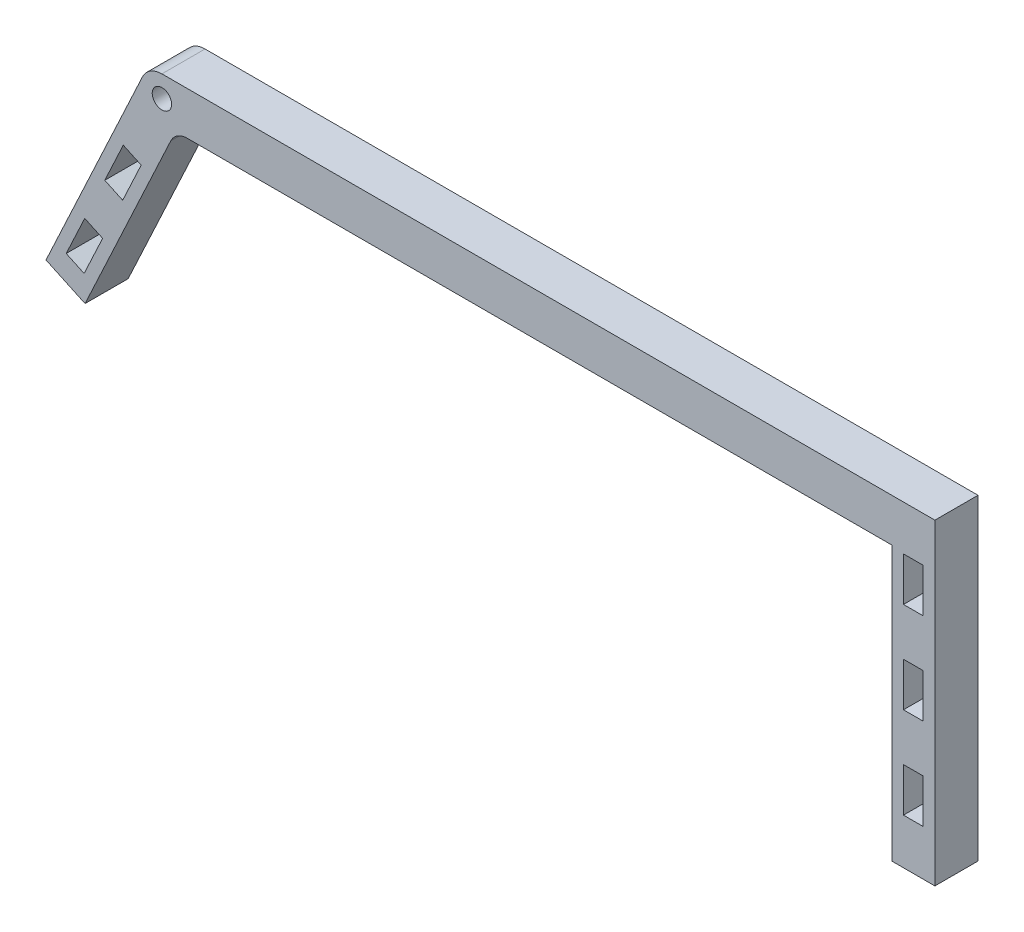
ISO-10303-21;
HEADER;
FILE_DESCRIPTION(('STEP AP214'),'2;1');
FILE_NAME('part.step','',(''),(''),'','','');
FILE_SCHEMA(('AUTOMOTIVE_DESIGN { 1 0 10303 214 1 1 1 1 }'));
ENDSEC;
DATA;
#1=APPLICATION_CONTEXT('core data for automotive mechanical design processes');
#2=APPLICATION_PROTOCOL_DEFINITION('international standard','automotive_design',2000,#1);
#3=PRODUCT_CONTEXT('',#1,'mechanical');
#4=PRODUCT('Part','Part','',(#3));
#5=PRODUCT_RELATED_PRODUCT_CATEGORY('part','',(#4));
#6=PRODUCT_DEFINITION_FORMATION('','',#4);
#7=PRODUCT_DEFINITION_CONTEXT('part definition',#1,'design');
#8=PRODUCT_DEFINITION('design','',#6,#7);
#9=PRODUCT_DEFINITION_SHAPE('','',#8);
#10=(LENGTH_UNIT() NAMED_UNIT(*) SI_UNIT(.MILLI.,.METRE.));
#11=(NAMED_UNIT(*) PLANE_ANGLE_UNIT() SI_UNIT($,.RADIAN.));
#12=(NAMED_UNIT(*) SI_UNIT($,.STERADIAN.) SOLID_ANGLE_UNIT());
#13=UNCERTAINTY_MEASURE_WITH_UNIT(LENGTH_MEASURE(1.E-05),#10,'distance_accuracy_value','');
#14=(GEOMETRIC_REPRESENTATION_CONTEXT(3) GLOBAL_UNCERTAINTY_ASSIGNED_CONTEXT((#13)) GLOBAL_UNIT_ASSIGNED_CONTEXT((#10,
#11,#12)) REPRESENTATION_CONTEXT('',''));
#15=CARTESIAN_POINT('',(0.,0.,0.));
#16=DIRECTION('',(0.,0.,1.));
#17=DIRECTION('',(1.,0.,0.));
#18=AXIS2_PLACEMENT_3D('',#15,#16,#17);
#19=CARTESIAN_POINT('',(50.925,-9.34999999999999,-3.));
#20=DIRECTION('',(0.,-1.,0.));
#21=DIRECTION('',(0.,0.,-1.));
#22=AXIS2_PLACEMENT_3D('',#19,#20,#21);
#23=PLANE('',#22);
#24=DIRECTION('',(1.,0.,0.));
#25=VECTOR('',#24,1.);
#26=CARTESIAN_POINT('',(0.,-9.34999999999999,3.));
#27=LINE('',#26,#25);
#28=CARTESIAN_POINT('',(50.925,-9.34999999999999,3.));
#29=VERTEX_POINT('',#28);
#30=CARTESIAN_POINT('',(53.675,-9.34999999999999,3.));
#31=VERTEX_POINT('',#30);
#32=EDGE_CURVE('E556',#29,#31,#27,.T.);
#33=ORIENTED_EDGE('',*,*,#32,.T.);
#34=DIRECTION('',(0.,0.,1.));
#35=VECTOR('',#34,1.);
#36=CARTESIAN_POINT('',(53.675,-9.34999999999999,-3.));
#37=LINE('',#36,#35);
#38=CARTESIAN_POINT('',(53.675,-9.34999999999999,-3.));
#39=VERTEX_POINT('',#38);
#40=EDGE_CURVE('E11',#39,#31,#37,.T.);
#41=ORIENTED_EDGE('',*,*,#40,.F.);
#42=DIRECTION('',(1.,0.,0.));
#43=VECTOR('',#42,1.);
#44=CARTESIAN_POINT('',(50.925,-9.34999999999999,-3.));
#45=LINE('',#44,#43);
#46=CARTESIAN_POINT('',(50.925,-9.34999999999999,-3.));
#47=VERTEX_POINT('',#46);
#48=EDGE_CURVE('E562',#47,#39,#45,.T.);
#49=ORIENTED_EDGE('',*,*,#48,.F.);
#50=DIRECTION('',(0.,0.,1.));
#51=VECTOR('',#50,1.);
#52=CARTESIAN_POINT('',(50.925,-9.34999999999999,-3.));
#53=LINE('',#52,#51);
#54=EDGE_CURVE('E570',#47,#29,#53,.T.);
#55=ORIENTED_EDGE('',*,*,#54,.T.);
#56=EDGE_LOOP('',(#33,#41,#49,#55));
#57=FACE_BOUND('',#56,.T.);
#58=ADVANCED_FACE('F49',(#57),#23,.F.);
#59=CARTESIAN_POINT('',(53.675,-3.25399999999999,-3.));
#60=DIRECTION('',(1.,0.,0.));
#61=DIRECTION('',(0.,0.,-1.));
#62=AXIS2_PLACEMENT_3D('',#59,#60,#61);
#63=PLANE('',#62);
#64=DIRECTION('',(0.,1.,0.));
#65=VECTOR('',#64,1.);
#66=CARTESIAN_POINT('',(53.675,25.4,3.));
#67=LINE('',#66,#65);
#68=CARTESIAN_POINT('',(53.675,-3.25399999999999,3.));
#69=VERTEX_POINT('',#68);
#70=EDGE_CURVE('E552',#31,#69,#67,.T.);
#71=ORIENTED_EDGE('',*,*,#70,.T.);
#72=DIRECTION('',(0.,0.,1.));
#73=VECTOR('',#72,1.);
#74=CARTESIAN_POINT('',(53.675,-3.25399999999999,-3.));
#75=LINE('',#74,#73);
#76=CARTESIAN_POINT('',(53.675,-3.25399999999999,-3.));
#77=VERTEX_POINT('',#76);
#78=EDGE_CURVE('E57',#77,#69,#75,.T.);
#79=ORIENTED_EDGE('',*,*,#78,.F.);
#80=DIRECTION('',(0.,1.,0.));
#81=VECTOR('',#80,1.);
#82=CARTESIAN_POINT('',(53.675,-3.25399999999999,-3.));
#83=LINE('',#82,#81);
#84=EDGE_CURVE('E71',#39,#77,#83,.T.);
#85=ORIENTED_EDGE('',*,*,#84,.F.);
#86=ORIENTED_EDGE('',*,*,#40,.T.);
#87=EDGE_LOOP('',(#71,#79,#85,#86));
#88=FACE_BOUND('',#87,.T.);
#89=ADVANCED_FACE('F583',(#88),#63,.F.);
#90=CARTESIAN_POINT('',(50.925,-3.25399999999999,-3.));
#91=DIRECTION('',(0.,1.,0.));
#92=DIRECTION('',(0.,0.,1.));
#93=AXIS2_PLACEMENT_3D('',#90,#91,#92);
#94=PLANE('',#93);
#95=DIRECTION('',(-1.,0.,0.));
#96=VECTOR('',#95,1.);
#97=CARTESIAN_POINT('',(0.,-3.25399999999999,3.));
#98=LINE('',#97,#96);
#99=CARTESIAN_POINT('',(50.925,-3.25399999999999,3.));
#100=VERTEX_POINT('',#99);
#101=EDGE_CURVE('E548',#69,#100,#98,.T.);
#102=ORIENTED_EDGE('',*,*,#101,.T.);
#103=DIRECTION('',(0.,0.,1.));
#104=VECTOR('',#103,1.);
#105=CARTESIAN_POINT('',(50.925,-3.25399999999999,-3.));
#106=LINE('',#105,#104);
#107=CARTESIAN_POINT('',(50.925,-3.25399999999999,-3.));
#108=VERTEX_POINT('',#107);
#109=EDGE_CURVE('E574',#108,#100,#106,.T.);
#110=ORIENTED_EDGE('',*,*,#109,.F.);
#111=DIRECTION('',(-1.,0.,0.));
#112=VECTOR('',#111,1.);
#113=CARTESIAN_POINT('',(50.925,-3.25399999999999,-3.));
#114=LINE('',#113,#112);
#115=EDGE_CURVE('E567',#77,#108,#114,.T.);
#116=ORIENTED_EDGE('',*,*,#115,.F.);
#117=ORIENTED_EDGE('',*,*,#78,.T.);
#118=EDGE_LOOP('',(#102,#110,#116,#117));
#119=FACE_BOUND('',#118,.T.);
#120=ADVANCED_FACE('F580',(#119),#94,.F.);
#121=CARTESIAN_POINT('',(50.925,-3.25399999999999,-3.));
#122=DIRECTION('',(-1.,0.,0.));
#123=DIRECTION('',(0.,0.,1.));
#124=AXIS2_PLACEMENT_3D('',#121,#122,#123);
#125=PLANE('',#124);
#126=DIRECTION('',(0.,-1.,0.));
#127=VECTOR('',#126,1.);
#128=CARTESIAN_POINT('',(50.925,25.4,3.));
#129=LINE('',#128,#127);
#130=EDGE_CURVE('E545',#100,#29,#129,.T.);
#131=ORIENTED_EDGE('',*,*,#130,.T.);
#132=ORIENTED_EDGE('',*,*,#54,.F.);
#133=DIRECTION('',(0.,-1.,0.));
#134=VECTOR('',#133,1.);
#135=CARTESIAN_POINT('',(50.925,-3.25399999999999,-3.));
#136=LINE('',#135,#134);
#137=EDGE_CURVE('E64',#108,#47,#136,.T.);
#138=ORIENTED_EDGE('',*,*,#137,.F.);
#139=ORIENTED_EDGE('',*,*,#109,.T.);
#140=EDGE_LOOP('',(#131,#132,#138,#139));
#141=FACE_BOUND('',#140,.T.);
#142=ADVANCED_FACE('F589',(#141),#125,.F.);
#143=CARTESIAN_POINT('',(0.,3.,3.));
#144=DIRECTION('',(0.,1.,0.));
#145=DIRECTION('',(-1.,0.,0.));
#146=AXIS2_PLACEMENT_3D('',#143,#144,#145);
#147=PLANE('',#146);
#148=DIRECTION('',(1.,0.,0.));
#149=VECTOR('',#148,1.);
#150=CARTESIAN_POINT('',(0.,3.,-3.));
#151=LINE('',#150,#149);
#152=CARTESIAN_POINT('',(-52.3,3.,-3.));
#153=VERTEX_POINT('',#152);
#154=CARTESIAN_POINT('',(55.3,3.,-3.));
#155=VERTEX_POINT('',#154);
#156=EDGE_CURVE('E474',#153,#155,#151,.T.);
#157=ORIENTED_EDGE('',*,*,#156,.F.);
#158=DIRECTION('',(0.,0.,-1.));
#159=VECTOR('',#158,1.);
#160=CARTESIAN_POINT('',(-52.3,3.,3.));
#161=LINE('',#160,#159);
#162=CARTESIAN_POINT('',(-52.3,3.,3.));
#163=VERTEX_POINT('',#162);
#164=EDGE_CURVE('E529',#163,#153,#161,.T.);
#165=ORIENTED_EDGE('',*,*,#164,.F.);
#166=DIRECTION('',(1.,0.,0.));
#167=VECTOR('',#166,1.);
#168=CARTESIAN_POINT('',(0.,3.,3.));
#169=LINE('',#168,#167);
#170=CARTESIAN_POINT('',(55.3,3.,3.));
#171=VERTEX_POINT('',#170);
#172=EDGE_CURVE('E437',#163,#171,#169,.T.);
#173=ORIENTED_EDGE('',*,*,#172,.T.);
#174=DIRECTION('',(0.,0.,-1.));
#175=VECTOR('',#174,1.);
#176=CARTESIAN_POINT('',(55.3,3.,3.));
#177=LINE('',#176,#175);
#178=EDGE_CURVE('E470',#171,#155,#177,.T.);
#179=ORIENTED_EDGE('',*,*,#178,.T.);
#180=EDGE_LOOP('',(#157,#165,#173,#179));
#181=FACE_BOUND('',#180,.T.);
#182=ADVANCED_FACE('F591',(#181),#147,.T.);
#183=CARTESIAN_POINT('',(-52.3,0.,3.));
#184=DIRECTION('',(0.,0.,-1.));
#185=DIRECTION('',(-1.,0.,0.));
#186=AXIS2_PLACEMENT_3D('',#183,#184,#185);
#187=CYLINDRICAL_SURFACE('',#186,2.99999999999999);
#188=CARTESIAN_POINT('',(-52.3,0.,-3.));
#189=DIRECTION('',(0.,0.,1.));
#190=DIRECTION('',(1.,0.,0.));
#191=AXIS2_PLACEMENT_3D('',#188,#189,#190);
#192=CIRCLE('',#191,2.99999999999999);
#193=CARTESIAN_POINT('',(-55.0189233611099,1.26785478522211,-3.));
#194=VERTEX_POINT('',#193);
#195=EDGE_CURVE('E478',#153,#194,#192,.T.);
#196=ORIENTED_EDGE('',*,*,#195,.T.);
#197=DIRECTION('',(0.,0.,-1.));
#198=VECTOR('',#197,1.);
#199=CARTESIAN_POINT('',(-55.0189233611099,1.26785478522211,3.));
#200=LINE('',#199,#198);
#201=CARTESIAN_POINT('',(-55.0189233611099,1.26785478522211,3.));
#202=VERTEX_POINT('',#201);
#203=EDGE_CURVE('E526',#202,#194,#200,.T.);
#204=ORIENTED_EDGE('',*,*,#203,.F.);
#205=CARTESIAN_POINT('',(-52.3,0.,3.));
#206=DIRECTION('',(0.,0.,1.));
#207=DIRECTION('',(1.,0.,0.));
#208=AXIS2_PLACEMENT_3D('',#205,#206,#207);
#209=CIRCLE('',#208,2.99999999999999);
#210=EDGE_CURVE('E442',#163,#202,#209,.T.);
#211=ORIENTED_EDGE('',*,*,#210,.F.);
#212=ORIENTED_EDGE('',*,*,#164,.T.);
#213=EDGE_LOOP('',(#196,#204,#211,#212));
#214=FACE_BOUND('',#213,.T.);
#215=ADVANCED_FACE('F598',(#214),#187,.T.);
#216=CARTESIAN_POINT('',(-45.6778193544113,21.2999169727848,3.));
#217=DIRECTION('',(-0.906307787036633,0.422618261740735,0.));
#218=DIRECTION('',(-0.422618261740735,-0.906307787036634,0.));
#219=AXIS2_PLACEMENT_3D('',#216,#217,#218);
#220=PLANE('',#219);
#221=DIRECTION('',(0.422618261740735,0.906307787036634,0.));
#222=VECTOR('',#221,1.);
#223=CARTESIAN_POINT('',(-45.6778193544113,21.2999169727848,-3.));
#224=LINE('',#223,#222);
#225=CARTESIAN_POINT('',(-68.4370531713773,-27.5074174531915,-3.));
#226=VERTEX_POINT('',#225);
#227=EDGE_CURVE('E482',#226,#194,#224,.T.);
#228=ORIENTED_EDGE('',*,*,#227,.F.);
#229=DIRECTION('',(0.,0.,-1.));
#230=VECTOR('',#229,1.);
#231=CARTESIAN_POINT('',(-68.4370531713773,-27.5074174531915,3.));
#232=LINE('',#231,#230);
#233=CARTESIAN_POINT('',(-68.4370531713773,-27.5074174531915,3.));
#234=VERTEX_POINT('',#233);
#235=EDGE_CURVE('E523',#234,#226,#232,.T.);
#236=ORIENTED_EDGE('',*,*,#235,.F.);
#237=DIRECTION('',(0.422618261740735,0.906307787036634,0.));
#238=VECTOR('',#237,1.);
#239=CARTESIAN_POINT('',(-45.6778193544113,21.2999169727848,3.));
#240=LINE('',#239,#238);
#241=EDGE_CURVE('E445',#234,#202,#240,.T.);
#242=ORIENTED_EDGE('',*,*,#241,.T.);
#243=ORIENTED_EDGE('',*,*,#203,.T.);
#244=EDGE_LOOP('',(#228,#236,#242,#243));
#245=FACE_BOUND('',#244,.T.);
#246=ADVANCED_FACE('F738',(#245),#220,.T.);
#247=CARTESIAN_POINT('',(-22.7592338169645,-48.807334425975,3.));
#248=DIRECTION('',(0.422618261740704,0.906307787036648,0.));
#249=DIRECTION('',(-0.906307787036648,0.422618261740704,0.));
#250=AXIS2_PLACEMENT_3D('',#247,#248,#249);
#251=PLANE('',#250);
#252=DIRECTION('',(0.906307787036648,-0.422618261740704,0.));
#253=VECTOR('',#252,1.);
#254=CARTESIAN_POINT('',(-22.7592338169645,-48.807334425975,-3.));
#255=LINE('',#254,#253);
#256=CARTESIAN_POINT('',(-62.9992064491574,-30.0431270236357,-3.));
#257=VERTEX_POINT('',#256);
#258=EDGE_CURVE('E486',#226,#257,#255,.T.);
#259=ORIENTED_EDGE('',*,*,#258,.T.);
#260=DIRECTION('',(0.,0.,-1.));
#261=VECTOR('',#260,1.);
#262=CARTESIAN_POINT('',(-62.9992064491574,-30.0431270236357,3.));
#263=LINE('',#262,#261);
#264=CARTESIAN_POINT('',(-62.9992064491574,-30.0431270236357,3.));
#265=VERTEX_POINT('',#264);
#266=EDGE_CURVE('E519',#265,#257,#263,.T.);
#267=ORIENTED_EDGE('',*,*,#266,.F.);
#268=DIRECTION('',(0.906307787036648,-0.422618261740704,0.));
#269=VECTOR('',#268,1.);
#270=CARTESIAN_POINT('',(-22.7592338169645,-48.807334425975,3.));
#271=LINE('',#270,#269);
#272=EDGE_CURVE('E449',#234,#265,#271,.T.);
#273=ORIENTED_EDGE('',*,*,#272,.F.);
#274=ORIENTED_EDGE('',*,*,#235,.T.);
#275=EDGE_LOOP('',(#259,#267,#273,#274));
#276=FACE_BOUND('',#275,.T.);
#277=ADVANCED_FACE('F734',(#276),#251,.F.);
#278=CARTESIAN_POINT('',(-40.2399726321929,18.7642074023393,3.));
#279=DIRECTION('',(0.906307787036648,-0.422618261740703,0.));
#280=DIRECTION('',(0.422618261740703,0.906307787036648,0.));
#281=AXIS2_PLACEMENT_3D('',#278,#279,#280);
#282=PLANE('',#281);
#283=DIRECTION('',(-0.422618261740703,-0.906307787036648,0.));
#284=VECTOR('',#283,1.);
#285=CARTESIAN_POINT('',(-40.2399726321929,18.7642074023393,-3.));
#286=LINE('',#285,#284);
#287=CARTESIAN_POINT('',(-51.0726525341996,-4.46654961517861,-3.));
#288=VERTEX_POINT('',#287);
#289=EDGE_CURVE('E490',#288,#257,#286,.T.);
#290=ORIENTED_EDGE('',*,*,#289,.F.);
#291=DIRECTION('',(0.,0.,-1.));
#292=VECTOR('',#291,1.);
#293=CARTESIAN_POINT('',(-51.0726525341996,-4.46654961517861,3.));
#294=LINE('',#293,#292);
#295=CARTESIAN_POINT('',(-51.0726525341996,-4.46654961517861,3.));
#296=VERTEX_POINT('',#295);
#297=EDGE_CURVE('E536',#288,#296,#294,.F.);
#298=ORIENTED_EDGE('',*,*,#297,.T.);
#299=DIRECTION('',(-0.422618261740703,-0.906307787036648,0.));
#300=VECTOR('',#299,1.);
#301=CARTESIAN_POINT('',(-40.2399726321929,18.7642074023393,3.));
#302=LINE('',#301,#300);
#303=EDGE_CURVE('E453',#296,#265,#302,.T.);
#304=ORIENTED_EDGE('',*,*,#303,.T.);
#305=ORIENTED_EDGE('',*,*,#266,.T.);
#306=EDGE_LOOP('',(#290,#298,#304,#305));
#307=FACE_BOUND('',#306,.T.);
#308=ADVANCED_FACE('F730',(#307),#282,.T.);
#309=CARTESIAN_POINT('',(0.,-3.,3.));
#310=DIRECTION('',(0.,1.,0.));
#311=DIRECTION('',(0.,0.,1.));
#312=AXIS2_PLACEMENT_3D('',#309,#310,#311);
#313=PLANE('',#312);
#314=DIRECTION('',(1.,0.,0.));
#315=VECTOR('',#314,1.);
#316=CARTESIAN_POINT('',(0.,-3.,3.));
#317=LINE('',#316,#315);
#318=CARTESIAN_POINT('',(-48.7706307551265,-3.,3.));
#319=VERTEX_POINT('',#318);
#320=CARTESIAN_POINT('',(49.3,-3.,3.));
#321=VERTEX_POINT('',#320);
#322=EDGE_CURVE('E456',#319,#321,#317,.T.);
#323=ORIENTED_EDGE('',*,*,#322,.F.);
#324=DIRECTION('',(0.,0.,-1.));
#325=VECTOR('',#324,1.);
#326=CARTESIAN_POINT('',(-48.7706307551265,-3.,3.));
#327=LINE('',#326,#325);
#328=CARTESIAN_POINT('',(-48.7706307551265,-3.,-3.));
#329=VERTEX_POINT('',#328);
#330=EDGE_CURVE('E532',#319,#329,#327,.T.);
#331=ORIENTED_EDGE('',*,*,#330,.T.);
#332=DIRECTION('',(1.,0.,0.));
#333=VECTOR('',#332,1.);
#334=CARTESIAN_POINT('',(0.,-3.,-3.));
#335=LINE('',#334,#333);
#336=CARTESIAN_POINT('',(49.3,-3.,-3.));
#337=VERTEX_POINT('',#336);
#338=EDGE_CURVE('E493',#329,#337,#335,.T.);
#339=ORIENTED_EDGE('',*,*,#338,.T.);
#340=DIRECTION('',(0.,0.,-1.));
#341=VECTOR('',#340,1.);
#342=CARTESIAN_POINT('',(49.3,-3.,3.));
#343=LINE('',#342,#341);
#344=EDGE_CURVE('E515',#321,#337,#343,.T.);
#345=ORIENTED_EDGE('',*,*,#344,.F.);
#346=EDGE_LOOP('',(#323,#331,#339,#345));
#347=FACE_BOUND('',#346,.T.);
#348=ADVANCED_FACE('F726',(#347),#313,.F.);
#349=CARTESIAN_POINT('',(49.3,0.,3.));
#350=DIRECTION('',(1.,0.,0.));
#351=DIRECTION('',(0.,1.,0.));
#352=AXIS2_PLACEMENT_3D('',#349,#350,#351);
#353=PLANE('',#352);
#354=DIRECTION('',(0.,-1.,0.));
#355=VECTOR('',#354,1.);
#356=CARTESIAN_POINT('',(49.3,0.,-3.));
#357=LINE('',#356,#355);
#358=CARTESIAN_POINT('',(49.3,-41.1,-3.));
#359=VERTEX_POINT('',#358);
#360=EDGE_CURVE('E496',#337,#359,#357,.T.);
#361=ORIENTED_EDGE('',*,*,#360,.T.);
#362=DIRECTION('',(0.,0.,-1.));
#363=VECTOR('',#362,1.);
#364=CARTESIAN_POINT('',(49.3,-41.1,3.));
#365=LINE('',#364,#363);
#366=CARTESIAN_POINT('',(49.3,-41.1,3.));
#367=VERTEX_POINT('',#366);
#368=EDGE_CURVE('E512',#367,#359,#365,.T.);
#369=ORIENTED_EDGE('',*,*,#368,.F.);
#370=DIRECTION('',(0.,-1.,0.));
#371=VECTOR('',#370,1.);
#372=CARTESIAN_POINT('',(49.3,0.,3.));
#373=LINE('',#372,#371);
#374=EDGE_CURVE('E459',#321,#367,#373,.T.);
#375=ORIENTED_EDGE('',*,*,#374,.F.);
#376=ORIENTED_EDGE('',*,*,#344,.T.);
#377=EDGE_LOOP('',(#361,#369,#375,#376));
#378=FACE_BOUND('',#377,.T.);
#379=ADVANCED_FACE('F722',(#378),#353,.F.);
#380=CARTESIAN_POINT('',(0.,-41.1,3.));
#381=DIRECTION('',(0.,-1.,0.));
#382=DIRECTION('',(0.,0.,-1.));
#383=AXIS2_PLACEMENT_3D('',#380,#381,#382);
#384=PLANE('',#383);
#385=DIRECTION('',(-1.,0.,0.));
#386=VECTOR('',#385,1.);
#387=CARTESIAN_POINT('',(0.,-41.1,-3.));
#388=LINE('',#387,#386);
#389=CARTESIAN_POINT('',(55.3,-41.1,-3.));
#390=VERTEX_POINT('',#389);
#391=EDGE_CURVE('E500',#390,#359,#388,.T.);
#392=ORIENTED_EDGE('',*,*,#391,.F.);
#393=DIRECTION('',(0.,0.,-1.));
#394=VECTOR('',#393,1.);
#395=CARTESIAN_POINT('',(55.3,-41.1,3.));
#396=LINE('',#395,#394);
#397=CARTESIAN_POINT('',(55.3,-41.1,3.));
#398=VERTEX_POINT('',#397);
#399=EDGE_CURVE('E509',#398,#390,#396,.T.);
#400=ORIENTED_EDGE('',*,*,#399,.F.);
#401=DIRECTION('',(-1.,0.,0.));
#402=VECTOR('',#401,1.);
#403=CARTESIAN_POINT('',(0.,-41.1,3.));
#404=LINE('',#403,#402);
#405=EDGE_CURVE('E462',#398,#367,#404,.T.);
#406=ORIENTED_EDGE('',*,*,#405,.T.);
#407=ORIENTED_EDGE('',*,*,#368,.T.);
#408=EDGE_LOOP('',(#392,#400,#406,#407));
#409=FACE_BOUND('',#408,.T.);
#410=ADVANCED_FACE('F719',(#409),#384,.T.);
#411=CARTESIAN_POINT('',(-52.3,0.,3.));
#412=DIRECTION('',(0.,0.,-1.));
#413=DIRECTION('',(-1.,0.,0.));
#414=AXIS2_PLACEMENT_3D('',#411,#412,#413);
#415=CYLINDRICAL_SURFACE('',#414,1.35);
#416=CARTESIAN_POINT('',(-52.3,0.,3.));
#417=DIRECTION('',(0.,0.,1.));
#418=DIRECTION('',(1.,0.,0.));
#419=AXIS2_PLACEMENT_3D('',#416,#417,#418);
#420=CIRCLE('',#419,1.35);
#421=CARTESIAN_POINT('',(-50.95,0.,3.));
#422=VERTEX_POINT('',#421);
#423=EDGE_CURVE('E433',#422,#422,#420,.T.);
#424=ORIENTED_EDGE('',*,*,#423,.T.);
#425=EDGE_LOOP('',(#424));
#426=FACE_BOUND('',#425,.T.);
#427=CARTESIAN_POINT('',(-52.3,0.,-3.));
#428=DIRECTION('',(0.,0.,1.));
#429=DIRECTION('',(1.,0.,0.));
#430=AXIS2_PLACEMENT_3D('',#427,#428,#429);
#431=CIRCLE('',#430,1.35);
#432=CARTESIAN_POINT('',(-50.95,0.,-3.));
#433=VERTEX_POINT('',#432);
#434=EDGE_CURVE('E432',#433,#433,#431,.T.);
#435=ORIENTED_EDGE('',*,*,#434,.F.);
#436=EDGE_LOOP('',(#435));
#437=FACE_BOUND('',#436,.T.);
#438=ADVANCED_FACE('F717',(#426,#437),#415,.F.);
#439=CARTESIAN_POINT('',(55.3,0.,3.));
#440=DIRECTION('',(1.,0.,0.));
#441=DIRECTION('',(0.,1.,0.));
#442=AXIS2_PLACEMENT_3D('',#439,#440,#441);
#443=PLANE('',#442);
#444=DIRECTION('',(0.,-1.,0.));
#445=VECTOR('',#444,1.);
#446=CARTESIAN_POINT('',(55.3,0.,-3.));
#447=LINE('',#446,#445);
#448=EDGE_CURVE('E438',#155,#390,#447,.T.);
#449=ORIENTED_EDGE('',*,*,#448,.F.);
#450=ORIENTED_EDGE('',*,*,#178,.F.);
#451=DIRECTION('',(0.,-1.,0.));
#452=VECTOR('',#451,1.);
#453=CARTESIAN_POINT('',(55.3,0.,3.));
#454=LINE('',#453,#452);
#455=EDGE_CURVE('E466',#171,#398,#454,.T.);
#456=ORIENTED_EDGE('',*,*,#455,.T.);
#457=ORIENTED_EDGE('',*,*,#399,.T.);
#458=EDGE_LOOP('',(#449,#450,#456,#457));
#459=FACE_BOUND('',#458,.T.);
#460=ADVANCED_FACE('F712',(#459),#443,.T.);
#461=CARTESIAN_POINT('',(0.,0.,3.));
#462=DIRECTION('',(0.,0.,1.));
#463=DIRECTION('',(1.,0.,0.));
#464=AXIS2_PLACEMENT_3D('',#461,#462,#463);
#465=PLANE('',#464);
#466=DIRECTION('',(0.,-1.,0.));
#467=VECTOR('',#466,1.);
#468=CARTESIAN_POINT('',(50.925,12.7,3.));
#469=LINE('',#468,#467);
#470=CARTESIAN_POINT('',(50.925,-15.954,3.));
#471=VERTEX_POINT('',#470);
#472=CARTESIAN_POINT('',(50.925,-22.05,3.));
#473=VERTEX_POINT('',#472);
#474=EDGE_CURVE('E293',#471,#473,#469,.T.);
#475=ORIENTED_EDGE('',*,*,#474,.F.);
#476=DIRECTION('',(-1.,0.,0.));
#477=VECTOR('',#476,1.);
#478=CARTESIAN_POINT('',(0.,-15.954,3.));
#479=LINE('',#478,#477);
#480=CARTESIAN_POINT('',(53.675,-15.954,3.));
#481=VERTEX_POINT('',#480);
#482=EDGE_CURVE('E272',#481,#471,#479,.T.);
#483=ORIENTED_EDGE('',*,*,#482,.F.);
#484=DIRECTION('',(0.,1.,0.));
#485=VECTOR('',#484,1.);
#486=CARTESIAN_POINT('',(53.675,12.7,3.));
#487=LINE('',#486,#485);
#488=CARTESIAN_POINT('',(53.675,-22.05,3.));
#489=VERTEX_POINT('',#488);
#490=EDGE_CURVE('E263',#489,#481,#487,.T.);
#491=ORIENTED_EDGE('',*,*,#490,.F.);
#492=DIRECTION('',(1.,0.,0.));
#493=VECTOR('',#492,1.);
#494=CARTESIAN_POINT('',(0.,-22.05,3.));
#495=LINE('',#494,#493);
#496=EDGE_CURVE('E248',#473,#489,#495,.T.);
#497=ORIENTED_EDGE('',*,*,#496,.F.);
#498=EDGE_LOOP('',(#475,#483,#491,#497));
#499=FACE_BOUND('',#498,.T.);
#500=DIRECTION('',(0.,-1.,0.));
#501=VECTOR('',#500,1.);
#502=CARTESIAN_POINT('',(50.925,0.,3.));
#503=LINE('',#502,#501);
#504=CARTESIAN_POINT('',(50.925,-28.654,3.));
#505=VERTEX_POINT('',#504);
#506=CARTESIAN_POINT('',(50.925,-34.75,3.));
#507=VERTEX_POINT('',#506);
#508=EDGE_CURVE('E340',#505,#507,#503,.T.);
#509=ORIENTED_EDGE('',*,*,#508,.F.);
#510=DIRECTION('',(-1.,0.,0.));
#511=VECTOR('',#510,1.);
#512=CARTESIAN_POINT('',(0.,-28.654,3.));
#513=LINE('',#512,#511);
#514=CARTESIAN_POINT('',(53.675,-28.654,3.));
#515=VERTEX_POINT('',#514);
#516=EDGE_CURVE('E337',#515,#505,#513,.T.);
#517=ORIENTED_EDGE('',*,*,#516,.F.);
#518=DIRECTION('',(0.,1.,0.));
#519=VECTOR('',#518,1.);
#520=CARTESIAN_POINT('',(53.675,0.,3.));
#521=LINE('',#520,#519);
#522=CARTESIAN_POINT('',(53.675,-34.75,3.));
#523=VERTEX_POINT('',#522);
#524=EDGE_CURVE('E334',#523,#515,#521,.T.);
#525=ORIENTED_EDGE('',*,*,#524,.F.);
#526=DIRECTION('',(1.,0.,0.));
#527=VECTOR('',#526,1.);
#528=CARTESIAN_POINT('',(0.,-34.75,3.));
#529=LINE('',#528,#527);
#530=EDGE_CURVE('E321',#507,#523,#529,.T.);
#531=ORIENTED_EDGE('',*,*,#530,.F.);
#532=EDGE_LOOP('',(#509,#517,#525,#531));
#533=FACE_BOUND('',#532,.T.);
#534=DIRECTION('',(-0.906307787036647,0.422618261740706,0.));
#535=VECTOR('',#534,1.);
#536=CARTESIAN_POINT('',(-13.4738879882597,-28.8948460369929,3.));
#537=LINE('',#536,#535);
#538=CARTESIAN_POINT('',(-55.1866107743869,-9.44388395932487,3.));
#539=VERTEX_POINT('',#538);
#540=CARTESIAN_POINT('',(-57.6789571887377,-8.28168373953793,3.));
#541=VERTEX_POINT('',#540);
#542=EDGE_CURVE('E384',#539,#541,#537,.T.);
#543=ORIENTED_EDGE('',*,*,#542,.F.);
#544=DIRECTION('',(0.422618261740701,0.906307787036649,0.));
#545=VECTOR('',#544,1.);
#546=CARTESIAN_POINT('',(-41.7127227861276,19.4509620776679,3.));
#547=LINE('',#546,#545);
#548=CARTESIAN_POINT('',(-57.7628916979583,-14.9687362291003,3.));
#549=VERTEX_POINT('',#548);
#550=EDGE_CURVE('E381',#549,#539,#547,.T.);
#551=ORIENTED_EDGE('',*,*,#550,.F.);
#552=DIRECTION('',(0.906307787036648,-0.422618261740703,0.));
#553=VECTOR('',#552,1.);
#554=CARTESIAN_POINT('',(-16.0501689118308,-34.4196983067682,3.));
#555=LINE('',#554,#553);
#556=CARTESIAN_POINT('',(-60.255238112309,-13.8065360093133,3.));
#557=VERTEX_POINT('',#556);
#558=EDGE_CURVE('E378',#557,#549,#555,.T.);
#559=ORIENTED_EDGE('',*,*,#558,.F.);
#560=DIRECTION('',(-0.422618261740704,-0.906307787036648,0.));
#561=VECTOR('',#560,1.);
#562=CARTESIAN_POINT('',(-44.2050692004782,20.6131622974549,3.));
#563=LINE('',#562,#561);
#564=EDGE_CURVE('E365',#541,#557,#563,.T.);
#565=ORIENTED_EDGE('',*,*,#564,.F.);
#566=EDGE_LOOP('',(#543,#551,#559,#565));
#567=FACE_BOUND('',#566,.T.);
#568=DIRECTION('',(-0.906307787036647,0.422618261740706,0.));
#569=VECTOR('',#568,1.);
#570=CARTESIAN_POINT('',(-18.8411399123666,-40.4049549323583,3.));
#571=LINE('',#570,#569);
#572=CARTESIAN_POINT('',(-60.5538626984939,-20.9539928546903,3.));
#573=VERTEX_POINT('',#572);
#574=CARTESIAN_POINT('',(-63.0462091128447,-19.7917926349034,3.));
#575=VERTEX_POINT('',#574);
#576=EDGE_CURVE('E428',#573,#575,#571,.T.);
#577=ORIENTED_EDGE('',*,*,#576,.F.);
#578=DIRECTION('',(0.422618261740701,0.906307787036649,0.));
#579=VECTOR('',#578,1.);
#580=CARTESIAN_POINT('',(-41.7127227861276,19.4509620776679,3.));
#581=LINE('',#580,#579);
#582=CARTESIAN_POINT('',(-63.1301436220652,-26.4788451244657,3.));
#583=VERTEX_POINT('',#582);
#584=EDGE_CURVE('E425',#583,#573,#581,.T.);
#585=ORIENTED_EDGE('',*,*,#584,.F.);
#586=DIRECTION('',(0.906307787036648,-0.422618261740703,0.));
#587=VECTOR('',#586,1.);
#588=CARTESIAN_POINT('',(-21.4174208359378,-45.9298072021336,3.));
#589=LINE('',#588,#587);
#590=CARTESIAN_POINT('',(-65.622490036416,-25.3166449046788,3.));
#591=VERTEX_POINT('',#590);
#592=EDGE_CURVE('E422',#591,#583,#589,.T.);
#593=ORIENTED_EDGE('',*,*,#592,.F.);
#594=DIRECTION('',(-0.422618261740704,-0.906307787036648,0.));
#595=VECTOR('',#594,1.);
#596=CARTESIAN_POINT('',(-44.2050692004782,20.6131622974549,3.));
#597=LINE('',#596,#595);
#598=EDGE_CURVE('E409',#575,#591,#597,.T.);
#599=ORIENTED_EDGE('',*,*,#598,.F.);
#600=EDGE_LOOP('',(#577,#585,#593,#599));
#601=FACE_BOUND('',#600,.T.);
#602=ORIENTED_EDGE('',*,*,#423,.F.);
#603=EDGE_LOOP('',(#602));
#604=FACE_BOUND('',#603,.T.);
#605=ORIENTED_EDGE('',*,*,#172,.F.);
#606=ORIENTED_EDGE('',*,*,#210,.T.);
#607=ORIENTED_EDGE('',*,*,#241,.F.);
#608=ORIENTED_EDGE('',*,*,#272,.T.);
#609=ORIENTED_EDGE('',*,*,#303,.F.);
#610=CARTESIAN_POINT('',(-48.7706307551265,-5.54,3.));
#611=DIRECTION('',(0.,0.,1.));
#612=DIRECTION('',(1.,0.,0.));
#613=AXIS2_PLACEMENT_3D('',#610,#611,#612);
#614=CIRCLE('',#613,2.54);
#615=EDGE_CURVE('E542',#296,#319,#614,.F.);
#616=ORIENTED_EDGE('',*,*,#615,.T.);
#617=ORIENTED_EDGE('',*,*,#322,.T.);
#618=ORIENTED_EDGE('',*,*,#374,.T.);
#619=ORIENTED_EDGE('',*,*,#405,.F.);
#620=ORIENTED_EDGE('',*,*,#455,.F.);
#621=EDGE_LOOP('',(#605,#606,#607,#608,#609,#616,#617,#618,#619,#620));
#622=FACE_BOUND('',#621,.T.);
#623=ORIENTED_EDGE('',*,*,#130,.F.);
#624=ORIENTED_EDGE('',*,*,#101,.F.);
#625=ORIENTED_EDGE('',*,*,#70,.F.);
#626=ORIENTED_EDGE('',*,*,#32,.F.);
#627=EDGE_LOOP('',(#623,#624,#625,#626));
#628=FACE_BOUND('',#627,.T.);
#629=ADVANCED_FACE('F270',(#499,#533,#567,#601,#604,#622,#628),#465,.T.);
#630=CARTESIAN_POINT('',(0.,0.,-3.));
#631=DIRECTION('',(0.,0.,1.));
#632=DIRECTION('',(1.,0.,0.));
#633=AXIS2_PLACEMENT_3D('',#630,#631,#632);
#634=PLANE('',#633);
#635=DIRECTION('',(-1.,0.,0.));
#636=VECTOR('',#635,1.);
#637=CARTESIAN_POINT('',(50.925,-15.954,-3.));
#638=LINE('',#637,#636);
#639=CARTESIAN_POINT('',(53.675,-15.954,-3.));
#640=VERTEX_POINT('',#639);
#641=CARTESIAN_POINT('',(50.925,-15.954,-3.));
#642=VERTEX_POINT('',#641);
#643=EDGE_CURVE('E289',#640,#642,#638,.T.);
#644=ORIENTED_EDGE('',*,*,#643,.T.);
#645=DIRECTION('',(0.,-1.,0.));
#646=VECTOR('',#645,1.);
#647=CARTESIAN_POINT('',(50.925,-15.954,-3.));
#648=LINE('',#647,#646);
#649=CARTESIAN_POINT('',(50.925,-22.05,-3.));
#650=VERTEX_POINT('',#649);
#651=EDGE_CURVE('E296',#642,#650,#648,.T.);
#652=ORIENTED_EDGE('',*,*,#651,.T.);
#653=DIRECTION('',(1.,0.,0.));
#654=VECTOR('',#653,1.);
#655=CARTESIAN_POINT('',(50.925,-22.05,-3.));
#656=LINE('',#655,#654);
#657=CARTESIAN_POINT('',(53.675,-22.05,-3.));
#658=VERTEX_POINT('',#657);
#659=EDGE_CURVE('E259',#650,#658,#656,.T.);
#660=ORIENTED_EDGE('',*,*,#659,.T.);
#661=DIRECTION('',(0.,1.,0.));
#662=VECTOR('',#661,1.);
#663=CARTESIAN_POINT('',(53.675,-15.954,-3.));
#664=LINE('',#663,#662);
#665=EDGE_CURVE('E266',#658,#640,#664,.T.);
#666=ORIENTED_EDGE('',*,*,#665,.T.);
#667=EDGE_LOOP('',(#644,#652,#660,#666));
#668=FACE_BOUND('',#667,.T.);
#669=DIRECTION('',(-1.,0.,0.));
#670=VECTOR('',#669,1.);
#671=CARTESIAN_POINT('',(50.925,-28.654,-3.));
#672=LINE('',#671,#670);
#673=CARTESIAN_POINT('',(53.675,-28.654,-3.));
#674=VERTEX_POINT('',#673);
#675=CARTESIAN_POINT('',(50.925,-28.654,-3.));
#676=VERTEX_POINT('',#675);
#677=EDGE_CURVE('E312',#674,#676,#672,.T.);
#678=ORIENTED_EDGE('',*,*,#677,.T.);
#679=DIRECTION('',(0.,-1.,0.));
#680=VECTOR('',#679,1.);
#681=CARTESIAN_POINT('',(50.925,-28.654,-3.));
#682=LINE('',#681,#680);
#683=CARTESIAN_POINT('',(50.925,-34.75,-3.));
#684=VERTEX_POINT('',#683);
#685=EDGE_CURVE('E300',#676,#684,#682,.T.);
#686=ORIENTED_EDGE('',*,*,#685,.T.);
#687=DIRECTION('',(1.,0.,0.));
#688=VECTOR('',#687,1.);
#689=CARTESIAN_POINT('',(50.925,-34.75,-3.));
#690=LINE('',#689,#688);
#691=CARTESIAN_POINT('',(53.675,-34.75,-3.));
#692=VERTEX_POINT('',#691);
#693=EDGE_CURVE('E304',#684,#692,#690,.T.);
#694=ORIENTED_EDGE('',*,*,#693,.T.);
#695=DIRECTION('',(0.,1.,0.));
#696=VECTOR('',#695,1.);
#697=CARTESIAN_POINT('',(53.675,-28.654,-3.));
#698=LINE('',#697,#696);
#699=EDGE_CURVE('E308',#692,#674,#698,.T.);
#700=ORIENTED_EDGE('',*,*,#699,.T.);
#701=EDGE_LOOP('',(#678,#686,#694,#700));
#702=FACE_BOUND('',#701,.T.);
#703=DIRECTION('',(0.422618261740701,0.906307787036649,0.));
#704=VECTOR('',#703,1.);
#705=CARTESIAN_POINT('',(-55.1866107743869,-9.44388395932487,-3.));
#706=LINE('',#705,#704);
#707=CARTESIAN_POINT('',(-57.7628916979583,-14.9687362291003,-3.));
#708=VERTEX_POINT('',#707);
#709=CARTESIAN_POINT('',(-55.1866107743869,-9.44388395932487,-3.));
#710=VERTEX_POINT('',#709);
#711=EDGE_CURVE('E356',#708,#710,#706,.T.);
#712=ORIENTED_EDGE('',*,*,#711,.T.);
#713=DIRECTION('',(-0.906307787036647,0.422618261740706,0.));
#714=VECTOR('',#713,1.);
#715=CARTESIAN_POINT('',(-57.6789571887377,-8.28168373953793,-3.));
#716=LINE('',#715,#714);
#717=CARTESIAN_POINT('',(-57.6789571887377,-8.28168373953793,-3.));
#718=VERTEX_POINT('',#717);
#719=EDGE_CURVE('E344',#710,#718,#716,.T.);
#720=ORIENTED_EDGE('',*,*,#719,.T.);
#721=DIRECTION('',(-0.422618261740704,-0.906307787036648,0.));
#722=VECTOR('',#721,1.);
#723=CARTESIAN_POINT('',(-57.6789571887377,-8.28168373953793,-3.));
#724=LINE('',#723,#722);
#725=CARTESIAN_POINT('',(-60.255238112309,-13.8065360093133,-3.));
#726=VERTEX_POINT('',#725);
#727=EDGE_CURVE('E348',#718,#726,#724,.T.);
#728=ORIENTED_EDGE('',*,*,#727,.T.);
#729=DIRECTION('',(0.906307787036648,-0.422618261740703,0.));
#730=VECTOR('',#729,1.);
#731=CARTESIAN_POINT('',(-60.255238112309,-13.8065360093133,-3.));
#732=LINE('',#731,#730);
#733=EDGE_CURVE('E352',#726,#708,#732,.T.);
#734=ORIENTED_EDGE('',*,*,#733,.T.);
#735=EDGE_LOOP('',(#712,#720,#728,#734));
#736=FACE_BOUND('',#735,.T.);
#737=DIRECTION('',(0.422618261740701,0.906307787036649,0.));
#738=VECTOR('',#737,1.);
#739=CARTESIAN_POINT('',(-60.5538626984939,-20.9539928546903,-3.));
#740=LINE('',#739,#738);
#741=CARTESIAN_POINT('',(-63.1301436220652,-26.4788451244657,-3.));
#742=VERTEX_POINT('',#741);
#743=CARTESIAN_POINT('',(-60.5538626984939,-20.9539928546903,-3.));
#744=VERTEX_POINT('',#743);
#745=EDGE_CURVE('E400',#742,#744,#740,.T.);
#746=ORIENTED_EDGE('',*,*,#745,.T.);
#747=DIRECTION('',(-0.906307787036647,0.422618261740706,0.));
#748=VECTOR('',#747,1.);
#749=CARTESIAN_POINT('',(-63.0462091128447,-19.7917926349034,-3.));
#750=LINE('',#749,#748);
#751=CARTESIAN_POINT('',(-63.0462091128447,-19.7917926349034,-3.));
#752=VERTEX_POINT('',#751);
#753=EDGE_CURVE('E388',#744,#752,#750,.T.);
#754=ORIENTED_EDGE('',*,*,#753,.T.);
#755=DIRECTION('',(-0.422618261740704,-0.906307787036648,0.));
#756=VECTOR('',#755,1.);
#757=CARTESIAN_POINT('',(-63.0462091128447,-19.7917926349034,-3.));
#758=LINE('',#757,#756);
#759=CARTESIAN_POINT('',(-65.622490036416,-25.3166449046788,-3.));
#760=VERTEX_POINT('',#759);
#761=EDGE_CURVE('E392',#752,#760,#758,.T.);
#762=ORIENTED_EDGE('',*,*,#761,.T.);
#763=DIRECTION('',(0.906307787036648,-0.422618261740703,0.));
#764=VECTOR('',#763,1.);
#765=CARTESIAN_POINT('',(-65.622490036416,-25.3166449046788,-3.));
#766=LINE('',#765,#764);
#767=EDGE_CURVE('E396',#760,#742,#766,.T.);
#768=ORIENTED_EDGE('',*,*,#767,.T.);
#769=EDGE_LOOP('',(#746,#754,#762,#768));
#770=FACE_BOUND('',#769,.T.);
#771=ORIENTED_EDGE('',*,*,#434,.T.);
#772=EDGE_LOOP('',(#771));
#773=FACE_BOUND('',#772,.T.);
#774=ORIENTED_EDGE('',*,*,#156,.T.);
#775=ORIENTED_EDGE('',*,*,#448,.T.);
#776=ORIENTED_EDGE('',*,*,#391,.T.);
#777=ORIENTED_EDGE('',*,*,#360,.F.);
#778=ORIENTED_EDGE('',*,*,#338,.F.);
#779=CARTESIAN_POINT('',(-48.7706307551265,-5.54,-3.));
#780=DIRECTION('',(0.,0.,1.));
#781=DIRECTION('',(1.,0.,0.));
#782=AXIS2_PLACEMENT_3D('',#779,#780,#781);
#783=CIRCLE('',#782,2.54);
#784=EDGE_CURVE('E539',#329,#288,#783,.T.);
#785=ORIENTED_EDGE('',*,*,#784,.T.);
#786=ORIENTED_EDGE('',*,*,#289,.T.);
#787=ORIENTED_EDGE('',*,*,#258,.F.);
#788=ORIENTED_EDGE('',*,*,#227,.T.);
#789=ORIENTED_EDGE('',*,*,#195,.F.);
#790=EDGE_LOOP('',(#774,#775,#776,#777,#778,#785,#786,#787,#788,#789));
#791=FACE_BOUND('',#790,.T.);
#792=ORIENTED_EDGE('',*,*,#137,.T.);
#793=ORIENTED_EDGE('',*,*,#48,.T.);
#794=ORIENTED_EDGE('',*,*,#84,.T.);
#795=ORIENTED_EDGE('',*,*,#115,.T.);
#796=EDGE_LOOP('',(#792,#793,#794,#795));
#797=FACE_BOUND('',#796,.T.);
#798=ADVANCED_FACE('F711',(#668,#702,#736,#770,#773,#791,#797),#634,.F.);
#799=CARTESIAN_POINT('',(-48.7706307551265,-5.54,3.));
#800=DIRECTION('',(0.,0.,-1.));
#801=DIRECTION('',(-1.,0.,0.));
#802=AXIS2_PLACEMENT_3D('',#799,#800,#801);
#803=CYLINDRICAL_SURFACE('',#802,2.54);
#804=ORIENTED_EDGE('',*,*,#615,.F.);
#805=ORIENTED_EDGE('',*,*,#297,.F.);
#806=ORIENTED_EDGE('',*,*,#784,.F.);
#807=ORIENTED_EDGE('',*,*,#330,.F.);
#808=EDGE_LOOP('',(#804,#805,#806,#807));
#809=FACE_BOUND('',#808,.T.);
#810=ADVANCED_FACE('F708',(#809),#803,.F.);
#811=CARTESIAN_POINT('',(-63.0462091128447,-19.7917926349034,-3.));
#812=DIRECTION('',(0.422618261740706,0.906307787036647,0.));
#813=DIRECTION('',(-0.906307787036647,0.422618261740706,0.));
#814=AXIS2_PLACEMENT_3D('',#811,#812,#813);
#815=PLANE('',#814);
#816=ORIENTED_EDGE('',*,*,#576,.T.);
#817=DIRECTION('',(0.,0.,1.));
#818=VECTOR('',#817,1.);
#819=CARTESIAN_POINT('',(-63.0462091128447,-19.7917926349034,-3.));
#820=LINE('',#819,#818);
#821=EDGE_CURVE('E404',#752,#575,#820,.T.);
#822=ORIENTED_EDGE('',*,*,#821,.F.);
#823=ORIENTED_EDGE('',*,*,#753,.F.);
#824=DIRECTION('',(0.,0.,1.));
#825=VECTOR('',#824,1.);
#826=CARTESIAN_POINT('',(-60.5538626984939,-20.9539928546903,-3.));
#827=LINE('',#826,#825);
#828=EDGE_CURVE('E405',#744,#573,#827,.T.);
#829=ORIENTED_EDGE('',*,*,#828,.T.);
#830=EDGE_LOOP('',(#816,#822,#823,#829));
#831=FACE_BOUND('',#830,.T.);
#832=ADVANCED_FACE('F698',(#831),#815,.F.);
#833=CARTESIAN_POINT('',(-60.5538626984939,-20.9539928546903,-3.));
#834=DIRECTION('',(0.906307787036649,-0.422618261740701,0.));
#835=DIRECTION('',(0.422618261740701,0.906307787036649,0.));
#836=AXIS2_PLACEMENT_3D('',#833,#834,#835);
#837=PLANE('',#836);
#838=ORIENTED_EDGE('',*,*,#584,.T.);
#839=ORIENTED_EDGE('',*,*,#828,.F.);
#840=ORIENTED_EDGE('',*,*,#745,.F.);
#841=DIRECTION('',(0.,0.,1.));
#842=VECTOR('',#841,1.);
#843=CARTESIAN_POINT('',(-63.1301436220652,-26.4788451244657,-3.));
#844=LINE('',#843,#842);
#845=EDGE_CURVE('E410',#742,#583,#844,.T.);
#846=ORIENTED_EDGE('',*,*,#845,.T.);
#847=EDGE_LOOP('',(#838,#839,#840,#846));
#848=FACE_BOUND('',#847,.T.);
#849=ADVANCED_FACE('F694',(#848),#837,.F.);
#850=CARTESIAN_POINT('',(-65.622490036416,-25.3166449046788,-3.));
#851=DIRECTION('',(-0.422618261740703,-0.906307787036648,0.));
#852=DIRECTION('',(0.906307787036648,-0.422618261740703,0.));
#853=AXIS2_PLACEMENT_3D('',#850,#851,#852);
#854=PLANE('',#853);
#855=ORIENTED_EDGE('',*,*,#592,.T.);
#856=ORIENTED_EDGE('',*,*,#845,.F.);
#857=ORIENTED_EDGE('',*,*,#767,.F.);
#858=DIRECTION('',(0.,0.,1.));
#859=VECTOR('',#858,1.);
#860=CARTESIAN_POINT('',(-65.622490036416,-25.3166449046788,-3.));
#861=LINE('',#860,#859);
#862=EDGE_CURVE('E414',#760,#591,#861,.T.);
#863=ORIENTED_EDGE('',*,*,#862,.T.);
#864=EDGE_LOOP('',(#855,#856,#857,#863));
#865=FACE_BOUND('',#864,.T.);
#866=ADVANCED_FACE('F697',(#865),#854,.F.);
#867=CARTESIAN_POINT('',(-63.0462091128447,-19.7917926349034,-3.));
#868=DIRECTION('',(-0.906307787036648,0.422618261740704,0.));
#869=DIRECTION('',(-0.422618261740704,-0.906307787036648,0.));
#870=AXIS2_PLACEMENT_3D('',#867,#868,#869);
#871=PLANE('',#870);
#872=ORIENTED_EDGE('',*,*,#598,.T.);
#873=ORIENTED_EDGE('',*,*,#862,.F.);
#874=ORIENTED_EDGE('',*,*,#761,.F.);
#875=ORIENTED_EDGE('',*,*,#821,.T.);
#876=EDGE_LOOP('',(#872,#873,#874,#875));
#877=FACE_BOUND('',#876,.T.);
#878=ADVANCED_FACE('F692',(#877),#871,.F.);
#879=CARTESIAN_POINT('',(-57.6789571887377,-8.28168373953793,-3.));
#880=DIRECTION('',(0.422618261740706,0.906307787036647,0.));
#881=DIRECTION('',(-0.906307787036647,0.422618261740706,0.));
#882=AXIS2_PLACEMENT_3D('',#879,#880,#881);
#883=PLANE('',#882);
#884=ORIENTED_EDGE('',*,*,#542,.T.);
#885=DIRECTION('',(0.,0.,1.));
#886=VECTOR('',#885,1.);
#887=CARTESIAN_POINT('',(-57.6789571887377,-8.28168373953793,-3.));
#888=LINE('',#887,#886);
#889=EDGE_CURVE('E360',#718,#541,#888,.T.);
#890=ORIENTED_EDGE('',*,*,#889,.F.);
#891=ORIENTED_EDGE('',*,*,#719,.F.);
#892=DIRECTION('',(0.,0.,1.));
#893=VECTOR('',#892,1.);
#894=CARTESIAN_POINT('',(-55.1866107743869,-9.44388395932487,-3.));
#895=LINE('',#894,#893);
#896=EDGE_CURVE('E361',#710,#539,#895,.T.);
#897=ORIENTED_EDGE('',*,*,#896,.T.);
#898=EDGE_LOOP('',(#884,#890,#891,#897));
#899=FACE_BOUND('',#898,.T.);
#900=ADVANCED_FACE('F682',(#899),#883,.F.);
#901=CARTESIAN_POINT('',(-55.1866107743869,-9.44388395932487,-3.));
#902=DIRECTION('',(0.906307787036649,-0.422618261740701,0.));
#903=DIRECTION('',(0.422618261740701,0.906307787036649,0.));
#904=AXIS2_PLACEMENT_3D('',#901,#902,#903);
#905=PLANE('',#904);
#906=ORIENTED_EDGE('',*,*,#550,.T.);
#907=ORIENTED_EDGE('',*,*,#896,.F.);
#908=ORIENTED_EDGE('',*,*,#711,.F.);
#909=DIRECTION('',(0.,0.,1.));
#910=VECTOR('',#909,1.);
#911=CARTESIAN_POINT('',(-57.7628916979583,-14.9687362291003,-3.));
#912=LINE('',#911,#910);
#913=EDGE_CURVE('E366',#708,#549,#912,.T.);
#914=ORIENTED_EDGE('',*,*,#913,.T.);
#915=EDGE_LOOP('',(#906,#907,#908,#914));
#916=FACE_BOUND('',#915,.T.);
#917=ADVANCED_FACE('F678',(#916),#905,.F.);
#918=CARTESIAN_POINT('',(-60.255238112309,-13.8065360093133,-3.));
#919=DIRECTION('',(-0.422618261740703,-0.906307787036648,0.));
#920=DIRECTION('',(0.906307787036648,-0.422618261740703,0.));
#921=AXIS2_PLACEMENT_3D('',#918,#919,#920);
#922=PLANE('',#921);
#923=ORIENTED_EDGE('',*,*,#558,.T.);
#924=ORIENTED_EDGE('',*,*,#913,.F.);
#925=ORIENTED_EDGE('',*,*,#733,.F.);
#926=DIRECTION('',(0.,0.,1.));
#927=VECTOR('',#926,1.);
#928=CARTESIAN_POINT('',(-60.255238112309,-13.8065360093133,-3.));
#929=LINE('',#928,#927);
#930=EDGE_CURVE('E370',#726,#557,#929,.T.);
#931=ORIENTED_EDGE('',*,*,#930,.T.);
#932=EDGE_LOOP('',(#923,#924,#925,#931));
#933=FACE_BOUND('',#932,.T.);
#934=ADVANCED_FACE('F681',(#933),#922,.F.);
#935=CARTESIAN_POINT('',(-57.6789571887377,-8.28168373953793,-3.));
#936=DIRECTION('',(-0.906307787036648,0.422618261740704,0.));
#937=DIRECTION('',(-0.422618261740704,-0.906307787036648,0.));
#938=AXIS2_PLACEMENT_3D('',#935,#936,#937);
#939=PLANE('',#938);
#940=ORIENTED_EDGE('',*,*,#564,.T.);
#941=ORIENTED_EDGE('',*,*,#930,.F.);
#942=ORIENTED_EDGE('',*,*,#727,.F.);
#943=ORIENTED_EDGE('',*,*,#889,.T.);
#944=EDGE_LOOP('',(#940,#941,#942,#943));
#945=FACE_BOUND('',#944,.T.);
#946=ADVANCED_FACE('F676',(#945),#939,.F.);
#947=CARTESIAN_POINT('',(50.925,-28.654,-3.));
#948=DIRECTION('',(-1.,0.,0.));
#949=DIRECTION('',(0.,0.,1.));
#950=AXIS2_PLACEMENT_3D('',#947,#948,#949);
#951=PLANE('',#950);
#952=ORIENTED_EDGE('',*,*,#508,.T.);
#953=DIRECTION('',(0.,0.,1.));
#954=VECTOR('',#953,1.);
#955=CARTESIAN_POINT('',(50.925,-34.75,-3.));
#956=LINE('',#955,#954);
#957=EDGE_CURVE('E316',#684,#507,#956,.T.);
#958=ORIENTED_EDGE('',*,*,#957,.F.);
#959=ORIENTED_EDGE('',*,*,#685,.F.);
#960=DIRECTION('',(0.,0.,1.));
#961=VECTOR('',#960,1.);
#962=CARTESIAN_POINT('',(50.925,-28.654,-3.));
#963=LINE('',#962,#961);
#964=EDGE_CURVE('E317',#676,#505,#963,.T.);
#965=ORIENTED_EDGE('',*,*,#964,.T.);
#966=EDGE_LOOP('',(#952,#958,#959,#965));
#967=FACE_BOUND('',#966,.T.);
#968=ADVANCED_FACE('F667',(#967),#951,.F.);
#969=CARTESIAN_POINT('',(50.925,-28.654,-3.));
#970=DIRECTION('',(0.,1.,0.));
#971=DIRECTION('',(0.,0.,1.));
#972=AXIS2_PLACEMENT_3D('',#969,#970,#971);
#973=PLANE('',#972);
#974=ORIENTED_EDGE('',*,*,#516,.T.);
#975=ORIENTED_EDGE('',*,*,#964,.F.);
#976=ORIENTED_EDGE('',*,*,#677,.F.);
#977=DIRECTION('',(0.,0.,1.));
#978=VECTOR('',#977,1.);
#979=CARTESIAN_POINT('',(53.675,-28.654,-3.));
#980=LINE('',#979,#978);
#981=EDGE_CURVE('E322',#674,#515,#980,.T.);
#982=ORIENTED_EDGE('',*,*,#981,.T.);
#983=EDGE_LOOP('',(#974,#975,#976,#982));
#984=FACE_BOUND('',#983,.T.);
#985=ADVANCED_FACE('F663',(#984),#973,.F.);
#986=CARTESIAN_POINT('',(53.675,-28.654,-3.));
#987=DIRECTION('',(1.,0.,0.));
#988=DIRECTION('',(0.,0.,-1.));
#989=AXIS2_PLACEMENT_3D('',#986,#987,#988);
#990=PLANE('',#989);
#991=ORIENTED_EDGE('',*,*,#524,.T.);
#992=ORIENTED_EDGE('',*,*,#981,.F.);
#993=ORIENTED_EDGE('',*,*,#699,.F.);
#994=DIRECTION('',(0.,0.,1.));
#995=VECTOR('',#994,1.);
#996=CARTESIAN_POINT('',(53.675,-34.75,-3.));
#997=LINE('',#996,#995);
#998=EDGE_CURVE('E326',#692,#523,#997,.T.);
#999=ORIENTED_EDGE('',*,*,#998,.T.);
#1000=EDGE_LOOP('',(#991,#992,#993,#999));
#1001=FACE_BOUND('',#1000,.T.);
#1002=ADVANCED_FACE('F666',(#1001),#990,.F.);
#1003=CARTESIAN_POINT('',(50.925,-34.75,-3.));
#1004=DIRECTION('',(0.,-1.,0.));
#1005=DIRECTION('',(0.,0.,-1.));
#1006=AXIS2_PLACEMENT_3D('',#1003,#1004,#1005);
#1007=PLANE('',#1006);
#1008=ORIENTED_EDGE('',*,*,#530,.T.);
#1009=ORIENTED_EDGE('',*,*,#998,.F.);
#1010=ORIENTED_EDGE('',*,*,#693,.F.);
#1011=ORIENTED_EDGE('',*,*,#957,.T.);
#1012=EDGE_LOOP('',(#1008,#1009,#1010,#1011));
#1013=FACE_BOUND('',#1012,.T.);
#1014=ADVANCED_FACE('F632',(#1013),#1007,.F.);
#1015=CARTESIAN_POINT('',(50.925,-15.954,-3.));
#1016=DIRECTION('',(-1.,0.,0.));
#1017=DIRECTION('',(0.,0.,1.));
#1018=AXIS2_PLACEMENT_3D('',#1015,#1016,#1017);
#1019=PLANE('',#1018);
#1020=ORIENTED_EDGE('',*,*,#474,.T.);
#1021=DIRECTION('',(0.,0.,1.));
#1022=VECTOR('',#1021,1.);
#1023=CARTESIAN_POINT('',(50.925,-22.05,-3.));
#1024=LINE('',#1023,#1022);
#1025=EDGE_CURVE('E254',#650,#473,#1024,.T.);
#1026=ORIENTED_EDGE('',*,*,#1025,.F.);
#1027=ORIENTED_EDGE('',*,*,#651,.F.);
#1028=DIRECTION('',(0.,0.,1.));
#1029=VECTOR('',#1028,1.);
#1030=CARTESIAN_POINT('',(50.925,-15.954,-3.));
#1031=LINE('',#1030,#1029);
#1032=EDGE_CURVE('E285',#642,#471,#1031,.T.);
#1033=ORIENTED_EDGE('',*,*,#1032,.T.);
#1034=EDGE_LOOP('',(#1020,#1026,#1027,#1033));
#1035=FACE_BOUND('',#1034,.T.);
#1036=ADVANCED_FACE('F625',(#1035),#1019,.F.);
#1037=CARTESIAN_POINT('',(50.925,-15.954,-3.));
#1038=DIRECTION('',(0.,1.,0.));
#1039=DIRECTION('',(0.,0.,1.));
#1040=AXIS2_PLACEMENT_3D('',#1037,#1038,#1039);
#1041=PLANE('',#1040);
#1042=ORIENTED_EDGE('',*,*,#482,.T.);
#1043=ORIENTED_EDGE('',*,*,#1032,.F.);
#1044=ORIENTED_EDGE('',*,*,#643,.F.);
#1045=DIRECTION('',(0.,0.,1.));
#1046=VECTOR('',#1045,1.);
#1047=CARTESIAN_POINT('',(53.675,-15.954,-3.));
#1048=LINE('',#1047,#1046);
#1049=EDGE_CURVE('E274',#640,#481,#1048,.T.);
#1050=ORIENTED_EDGE('',*,*,#1049,.T.);
#1051=EDGE_LOOP('',(#1042,#1043,#1044,#1050));
#1052=FACE_BOUND('',#1051,.T.);
#1053=ADVANCED_FACE('F631',(#1052),#1041,.F.);
#1054=CARTESIAN_POINT('',(53.675,-15.954,-3.));
#1055=DIRECTION('',(1.,0.,0.));
#1056=DIRECTION('',(0.,0.,-1.));
#1057=AXIS2_PLACEMENT_3D('',#1054,#1055,#1056);
#1058=PLANE('',#1057);
#1059=ORIENTED_EDGE('',*,*,#490,.T.);
#1060=ORIENTED_EDGE('',*,*,#1049,.F.);
#1061=ORIENTED_EDGE('',*,*,#665,.F.);
#1062=DIRECTION('',(0.,0.,1.));
#1063=VECTOR('',#1062,1.);
#1064=CARTESIAN_POINT('',(53.675,-22.05,-3.));
#1065=LINE('',#1064,#1063);
#1066=EDGE_CURVE('E251',#658,#489,#1065,.T.);
#1067=ORIENTED_EDGE('',*,*,#1066,.T.);
#1068=EDGE_LOOP('',(#1059,#1060,#1061,#1067));
#1069=FACE_BOUND('',#1068,.T.);
#1070=ADVANCED_FACE('F262',(#1069),#1058,.F.);
#1071=CARTESIAN_POINT('',(50.925,-22.05,-3.));
#1072=DIRECTION('',(0.,-1.,0.));
#1073=DIRECTION('',(0.,0.,-1.));
#1074=AXIS2_PLACEMENT_3D('',#1071,#1072,#1073);
#1075=PLANE('',#1074);
#1076=ORIENTED_EDGE('',*,*,#496,.T.);
#1077=ORIENTED_EDGE('',*,*,#1066,.F.);
#1078=ORIENTED_EDGE('',*,*,#659,.F.);
#1079=ORIENTED_EDGE('',*,*,#1025,.T.);
#1080=EDGE_LOOP('',(#1076,#1077,#1078,#1079));
#1081=FACE_BOUND('',#1080,.T.);
#1082=ADVANCED_FACE('F250',(#1081),#1075,.F.);
#1083=CLOSED_SHELL('',(#58,#89,#120,#142,#182,#215,#246,#277,#308,#348,#379,#410,#438,#460,#629,
#798,#810,#832,#849,#866,#878,#900,#917,#934,#946,#968,#985,#1002,#1014,#1036,#1053,#1070,#1082));
#1084=MANIFOLD_SOLID_BREP('B2',#1083);
#1085=ADVANCED_BREP_SHAPE_REPRESENTATION('',(#18,#1084),#14);
#1086=SHAPE_DEFINITION_REPRESENTATION(#9,#1085);
ENDSEC;
END-ISO-10303-21;
